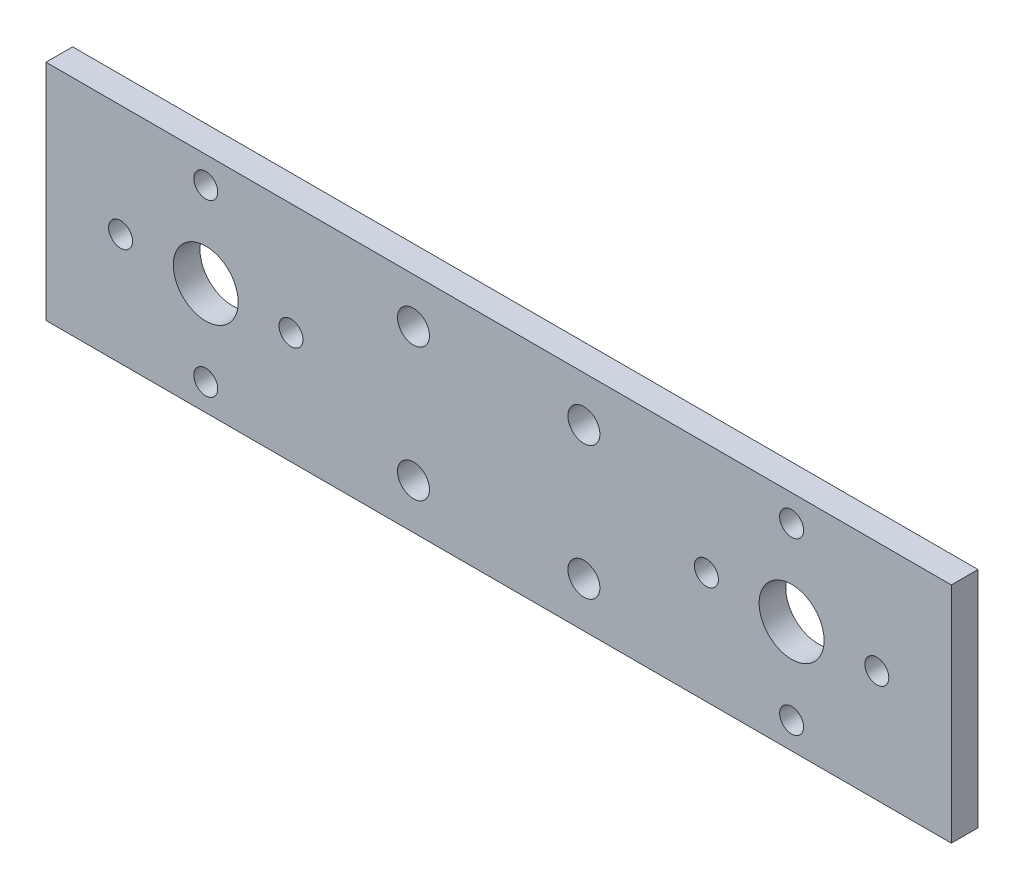
ISO-10303-21;
HEADER;
FILE_DESCRIPTION(('STEP AP214'),'2;1');
FILE_NAME('part.step','',(''),(''),'','','');
FILE_SCHEMA(('AUTOMOTIVE_DESIGN { 1 0 10303 214 1 1 1 1 }'));
ENDSEC;
DATA;
#1=APPLICATION_CONTEXT('core data for automotive mechanical design processes');
#2=APPLICATION_PROTOCOL_DEFINITION('international standard','automotive_design',2000,#1);
#3=PRODUCT_CONTEXT('',#1,'mechanical');
#4=PRODUCT('Part','Part','',(#3));
#5=PRODUCT_RELATED_PRODUCT_CATEGORY('part','',(#4));
#6=PRODUCT_DEFINITION_FORMATION('','',#4);
#7=PRODUCT_DEFINITION_CONTEXT('part definition',#1,'design');
#8=PRODUCT_DEFINITION('design','',#6,#7);
#9=PRODUCT_DEFINITION_SHAPE('','',#8);
#10=(LENGTH_UNIT() NAMED_UNIT(*) SI_UNIT(.MILLI.,.METRE.));
#11=(NAMED_UNIT(*) PLANE_ANGLE_UNIT() SI_UNIT($,.RADIAN.));
#12=(NAMED_UNIT(*) SI_UNIT($,.STERADIAN.) SOLID_ANGLE_UNIT());
#13=UNCERTAINTY_MEASURE_WITH_UNIT(LENGTH_MEASURE(1.E-05),#10,'distance_accuracy_value','');
#14=(GEOMETRIC_REPRESENTATION_CONTEXT(3) GLOBAL_UNCERTAINTY_ASSIGNED_CONTEXT((#13)) GLOBAL_UNIT_ASSIGNED_CONTEXT((#10,
#11,#12)) REPRESENTATION_CONTEXT('',''));
#15=CARTESIAN_POINT('',(0.,0.,0.));
#16=DIRECTION('',(0.,0.,1.));
#17=DIRECTION('',(1.,0.,0.));
#18=AXIS2_PLACEMENT_3D('',#15,#16,#17);
#19=CARTESIAN_POINT('',(85.,21.,5.));
#20=DIRECTION('',(-1.,0.,0.));
#21=DIRECTION('',(0.,0.,1.));
#22=AXIS2_PLACEMENT_3D('',#19,#20,#21);
#23=PLANE('',#22);
#24=DIRECTION('',(0.,1.,0.));
#25=VECTOR('',#24,1.);
#26=CARTESIAN_POINT('',(85.,21.,0.));
#27=LINE('',#26,#25);
#28=CARTESIAN_POINT('',(85.,-21.,0.));
#29=VERTEX_POINT('',#28);
#30=CARTESIAN_POINT('',(85.,21.,0.));
#31=VERTEX_POINT('',#30);
#32=EDGE_CURVE('E111',#29,#31,#27,.T.);
#33=ORIENTED_EDGE('',*,*,#32,.T.);
#34=DIRECTION('',(0.,0.,-1.));
#35=VECTOR('',#34,1.);
#36=CARTESIAN_POINT('',(85.,21.,5.));
#37=LINE('',#36,#35);
#38=CARTESIAN_POINT('',(85.,21.,5.));
#39=VERTEX_POINT('',#38);
#40=EDGE_CURVE('E11',#39,#31,#37,.T.);
#41=ORIENTED_EDGE('',*,*,#40,.F.);
#42=DIRECTION('',(0.,1.,0.));
#43=VECTOR('',#42,1.);
#44=CARTESIAN_POINT('',(85.,21.,5.));
#45=LINE('',#44,#43);
#46=CARTESIAN_POINT('',(85.,-21.,5.));
#47=VERTEX_POINT('',#46);
#48=EDGE_CURVE('E95',#47,#39,#45,.T.);
#49=ORIENTED_EDGE('',*,*,#48,.F.);
#50=DIRECTION('',(0.,0.,-1.));
#51=VECTOR('',#50,1.);
#52=CARTESIAN_POINT('',(85.,-21.,5.));
#53=LINE('',#52,#51);
#54=EDGE_CURVE('E107',#47,#29,#53,.T.);
#55=ORIENTED_EDGE('',*,*,#54,.T.);
#56=EDGE_LOOP('',(#33,#41,#49,#55));
#57=FACE_BOUND('',#56,.T.);
#58=ADVANCED_FACE('F43',(#57),#23,.F.);
#59=CARTESIAN_POINT('',(-85.,21.,5.));
#60=DIRECTION('',(0.,-1.,0.));
#61=DIRECTION('',(0.,0.,-1.));
#62=AXIS2_PLACEMENT_3D('',#59,#60,#61);
#63=PLANE('',#62);
#64=DIRECTION('',(-1.,0.,0.));
#65=VECTOR('',#64,1.);
#66=CARTESIAN_POINT('',(-85.,21.,0.));
#67=LINE('',#66,#65);
#68=CARTESIAN_POINT('',(-85.,21.,0.));
#69=VERTEX_POINT('',#68);
#70=EDGE_CURVE('E100',#31,#69,#67,.T.);
#71=ORIENTED_EDGE('',*,*,#70,.T.);
#72=DIRECTION('',(0.,0.,-1.));
#73=VECTOR('',#72,1.);
#74=CARTESIAN_POINT('',(-85.,21.,5.));
#75=LINE('',#74,#73);
#76=CARTESIAN_POINT('',(-85.,21.,5.));
#77=VERTEX_POINT('',#76);
#78=EDGE_CURVE('E52',#77,#69,#75,.T.);
#79=ORIENTED_EDGE('',*,*,#78,.F.);
#80=DIRECTION('',(-1.,0.,0.));
#81=VECTOR('',#80,1.);
#82=CARTESIAN_POINT('',(-85.,21.,5.));
#83=LINE('',#82,#81);
#84=EDGE_CURVE('E90',#39,#77,#83,.T.);
#85=ORIENTED_EDGE('',*,*,#84,.F.);
#86=ORIENTED_EDGE('',*,*,#40,.T.);
#87=EDGE_LOOP('',(#71,#79,#85,#86));
#88=FACE_BOUND('',#87,.T.);
#89=ADVANCED_FACE('F99',(#88),#63,.F.);
#90=CARTESIAN_POINT('',(-85.,21.,5.));
#91=DIRECTION('',(1.,0.,0.));
#92=DIRECTION('',(0.,0.,-1.));
#93=AXIS2_PLACEMENT_3D('',#90,#91,#92);
#94=PLANE('',#93);
#95=DIRECTION('',(0.,-1.,0.));
#96=VECTOR('',#95,1.);
#97=CARTESIAN_POINT('',(-85.,21.,0.));
#98=LINE('',#97,#96);
#99=CARTESIAN_POINT('',(-85.,-21.,0.));
#100=VERTEX_POINT('',#99);
#101=EDGE_CURVE('E77',#69,#100,#98,.T.);
#102=ORIENTED_EDGE('',*,*,#101,.T.);
#103=DIRECTION('',(0.,0.,-1.));
#104=VECTOR('',#103,1.);
#105=CARTESIAN_POINT('',(-85.,-21.,5.));
#106=LINE('',#105,#104);
#107=CARTESIAN_POINT('',(-85.,-21.,5.));
#108=VERTEX_POINT('',#107);
#109=EDGE_CURVE('E102',#108,#100,#106,.T.);
#110=ORIENTED_EDGE('',*,*,#109,.F.);
#111=DIRECTION('',(0.,-1.,0.));
#112=VECTOR('',#111,1.);
#113=CARTESIAN_POINT('',(-85.,21.,5.));
#114=LINE('',#113,#112);
#115=EDGE_CURVE('E93',#77,#108,#114,.T.);
#116=ORIENTED_EDGE('',*,*,#115,.F.);
#117=ORIENTED_EDGE('',*,*,#78,.T.);
#118=EDGE_LOOP('',(#102,#110,#116,#117));
#119=FACE_BOUND('',#118,.T.);
#120=ADVANCED_FACE('F103',(#119),#94,.F.);
#121=CARTESIAN_POINT('',(-85.,-21.,5.));
#122=DIRECTION('',(0.,1.,0.));
#123=DIRECTION('',(0.,0.,1.));
#124=AXIS2_PLACEMENT_3D('',#121,#122,#123);
#125=PLANE('',#124);
#126=DIRECTION('',(1.,0.,0.));
#127=VECTOR('',#126,1.);
#128=CARTESIAN_POINT('',(-85.,-21.,0.));
#129=LINE('',#128,#127);
#130=EDGE_CURVE('E83',#100,#29,#129,.T.);
#131=ORIENTED_EDGE('',*,*,#130,.T.);
#132=ORIENTED_EDGE('',*,*,#54,.F.);
#133=DIRECTION('',(1.,0.,0.));
#134=VECTOR('',#133,1.);
#135=CARTESIAN_POINT('',(-85.,-21.,5.));
#136=LINE('',#135,#134);
#137=EDGE_CURVE('E60',#108,#47,#136,.T.);
#138=ORIENTED_EDGE('',*,*,#137,.F.);
#139=ORIENTED_EDGE('',*,*,#109,.T.);
#140=EDGE_LOOP('',(#131,#132,#138,#139));
#141=FACE_BOUND('',#140,.T.);
#142=ADVANCED_FACE('F125',(#141),#125,.F.);
#143=CARTESIAN_POINT('',(0.,0.,5.));
#144=DIRECTION('',(0.,0.,1.));
#145=DIRECTION('',(1.,0.,0.));
#146=AXIS2_PLACEMENT_3D('',#143,#144,#145);
#147=PLANE('',#146);
#148=CARTESIAN_POINT('',(-71.,0.,5.));
#149=DIRECTION('',(0.,0.,1.));
#150=DIRECTION('',(1.,0.,0.));
#151=AXIS2_PLACEMENT_3D('',#148,#149,#150);
#152=CIRCLE('',#151,2.25);
#153=CARTESIAN_POINT('',(-68.75,0.,5.));
#154=VERTEX_POINT('',#153);
#155=EDGE_CURVE('E222',#154,#154,#152,.T.);
#156=ORIENTED_EDGE('',*,*,#155,.F.);
#157=EDGE_LOOP('',(#156));
#158=FACE_BOUND('',#157,.T.);
#159=CARTESIAN_POINT('',(39.,-3.88578058618805E-13,5.));
#160=DIRECTION('',(0.,0.,1.));
#161=DIRECTION('',(1.,0.,0.));
#162=AXIS2_PLACEMENT_3D('',#159,#160,#161);
#163=CIRCLE('',#162,2.25);
#164=CARTESIAN_POINT('',(41.25,-3.88578058618805E-13,5.));
#165=VERTEX_POINT('',#164);
#166=EDGE_CURVE('E226',#165,#165,#163,.T.);
#167=ORIENTED_EDGE('',*,*,#166,.F.);
#168=EDGE_LOOP('',(#167));
#169=FACE_BOUND('',#168,.T.);
#170=CARTESIAN_POINT('',(-55.0000000000002,-16.,5.));
#171=DIRECTION('',(0.,0.,1.));
#172=DIRECTION('',(1.,0.,0.));
#173=AXIS2_PLACEMENT_3D('',#170,#171,#172);
#174=CIRCLE('',#173,2.24999999999999);
#175=CARTESIAN_POINT('',(-52.7500000000002,-16.,5.));
#176=VERTEX_POINT('',#175);
#177=EDGE_CURVE('E210',#176,#176,#174,.T.);
#178=ORIENTED_EDGE('',*,*,#177,.F.);
#179=EDGE_LOOP('',(#178));
#180=FACE_BOUND('',#179,.T.);
#181=CARTESIAN_POINT('',(-39.,-1.15427216060123E-13,5.));
#182=DIRECTION('',(0.,0.,1.));
#183=DIRECTION('',(1.,0.,0.));
#184=AXIS2_PLACEMENT_3D('',#181,#182,#183);
#185=CIRCLE('',#184,2.24999999999999);
#186=CARTESIAN_POINT('',(-36.75,-1.15427216060123E-13,5.));
#187=VERTEX_POINT('',#186);
#188=EDGE_CURVE('E209',#187,#187,#185,.T.);
#189=ORIENTED_EDGE('',*,*,#188,.F.);
#190=EDGE_LOOP('',(#189));
#191=FACE_BOUND('',#190,.T.);
#192=CARTESIAN_POINT('',(-54.9999999999999,16.,5.));
#193=DIRECTION('',(0.,0.,1.));
#194=DIRECTION('',(1.,0.,0.));
#195=AXIS2_PLACEMENT_3D('',#192,#193,#194);
#196=CIRCLE('',#195,2.24999999999999);
#197=CARTESIAN_POINT('',(-52.75,16.,5.));
#198=VERTEX_POINT('',#197);
#199=EDGE_CURVE('E218',#198,#198,#196,.T.);
#200=ORIENTED_EDGE('',*,*,#199,.F.);
#201=EDGE_LOOP('',(#200));
#202=FACE_BOUND('',#201,.T.);
#203=CARTESIAN_POINT('',(55.0000000000001,15.9999999999996,5.));
#204=DIRECTION('',(0.,0.,1.));
#205=DIRECTION('',(1.,0.,0.));
#206=AXIS2_PLACEMENT_3D('',#203,#204,#205);
#207=CIRCLE('',#206,2.25);
#208=CARTESIAN_POINT('',(57.2500000000001,15.9999999999996,5.));
#209=VERTEX_POINT('',#208);
#210=EDGE_CURVE('E200',#209,#209,#207,.T.);
#211=ORIENTED_EDGE('',*,*,#210,.F.);
#212=EDGE_LOOP('',(#211));
#213=FACE_BOUND('',#212,.T.);
#214=CARTESIAN_POINT('',(71.,-4.9960036108132E-13,5.));
#215=DIRECTION('',(0.,0.,1.));
#216=DIRECTION('',(1.,0.,0.));
#217=AXIS2_PLACEMENT_3D('',#214,#215,#216);
#218=CIRCLE('',#217,2.24999999999999);
#219=CARTESIAN_POINT('',(73.25,-4.9960036108132E-13,5.));
#220=VERTEX_POINT('',#219);
#221=EDGE_CURVE('E192',#220,#220,#218,.T.);
#222=ORIENTED_EDGE('',*,*,#221,.F.);
#223=EDGE_LOOP('',(#222));
#224=FACE_BOUND('',#223,.T.);
#225=CARTESIAN_POINT('',(54.9999999999998,-16.0000000000004,5.));
#226=DIRECTION('',(0.,0.,1.));
#227=DIRECTION('',(1.,0.,0.));
#228=AXIS2_PLACEMENT_3D('',#225,#226,#227);
#229=CIRCLE('',#228,2.24999999999999);
#230=CARTESIAN_POINT('',(57.2499999999998,-16.0000000000004,5.));
#231=VERTEX_POINT('',#230);
#232=EDGE_CURVE('E184',#231,#231,#229,.T.);
#233=ORIENTED_EDGE('',*,*,#232,.F.);
#234=EDGE_LOOP('',(#233));
#235=FACE_BOUND('',#234,.T.);
#236=CARTESIAN_POINT('',(16.0000000000001,-12.4999999999996,5.));
#237=DIRECTION('',(0.,0.,1.));
#238=DIRECTION('',(1.,0.,0.));
#239=AXIS2_PLACEMENT_3D('',#236,#237,#238);
#240=CIRCLE('',#239,2.99999999999999);
#241=CARTESIAN_POINT('',(19.0000000000001,-12.4999999999996,5.));
#242=VERTEX_POINT('',#241);
#243=EDGE_CURVE('E160',#242,#242,#240,.T.);
#244=ORIENTED_EDGE('',*,*,#243,.F.);
#245=EDGE_LOOP('',(#244));
#246=FACE_BOUND('',#245,.T.);
#247=CARTESIAN_POINT('',(16.,12.5000000000004,5.));
#248=DIRECTION('',(0.,0.,1.));
#249=DIRECTION('',(1.,0.,0.));
#250=AXIS2_PLACEMENT_3D('',#247,#248,#249);
#251=CIRCLE('',#250,3.);
#252=CARTESIAN_POINT('',(19.,12.5000000000004,5.));
#253=VERTEX_POINT('',#252);
#254=EDGE_CURVE('E169',#253,#253,#251,.T.);
#255=ORIENTED_EDGE('',*,*,#254,.F.);
#256=EDGE_LOOP('',(#255));
#257=FACE_BOUND('',#256,.T.);
#258=CARTESIAN_POINT('',(-16.,12.4999999999999,5.));
#259=DIRECTION('',(0.,0.,1.));
#260=DIRECTION('',(1.,0.,0.));
#261=AXIS2_PLACEMENT_3D('',#258,#259,#260);
#262=CIRCLE('',#261,3.);
#263=CARTESIAN_POINT('',(-13.,12.4999999999999,5.));
#264=VERTEX_POINT('',#263);
#265=EDGE_CURVE('E152',#264,#264,#262,.T.);
#266=ORIENTED_EDGE('',*,*,#265,.F.);
#267=EDGE_LOOP('',(#266));
#268=FACE_BOUND('',#267,.T.);
#269=CARTESIAN_POINT('',(-16.,-12.5000000000001,5.));
#270=DIRECTION('',(0.,0.,1.));
#271=DIRECTION('',(1.,0.,0.));
#272=AXIS2_PLACEMENT_3D('',#269,#270,#271);
#273=CIRCLE('',#272,3.);
#274=CARTESIAN_POINT('',(-13.,-12.5000000000001,5.));
#275=VERTEX_POINT('',#274);
#276=EDGE_CURVE('E148',#275,#275,#273,.T.);
#277=ORIENTED_EDGE('',*,*,#276,.F.);
#278=EDGE_LOOP('',(#277));
#279=FACE_BOUND('',#278,.T.);
#280=CARTESIAN_POINT('',(-55.,0.,5.));
#281=DIRECTION('',(0.,0.,1.));
#282=DIRECTION('',(1.,0.,0.));
#283=AXIS2_PLACEMENT_3D('',#280,#281,#282);
#284=CIRCLE('',#283,6.1);
#285=CARTESIAN_POINT('',(-48.9,0.,5.));
#286=VERTEX_POINT('',#285);
#287=EDGE_CURVE('E115',#286,#286,#284,.T.);
#288=ORIENTED_EDGE('',*,*,#287,.F.);
#289=EDGE_LOOP('',(#288));
#290=FACE_BOUND('',#289,.T.);
#291=CARTESIAN_POINT('',(55.,-3.90798504668055E-13,5.));
#292=DIRECTION('',(0.,0.,1.));
#293=DIRECTION('',(1.,0.,0.));
#294=AXIS2_PLACEMENT_3D('',#291,#292,#293);
#295=CIRCLE('',#294,6.1);
#296=CARTESIAN_POINT('',(61.1,-3.90798504668055E-13,5.));
#297=VERTEX_POINT('',#296);
#298=EDGE_CURVE('E135',#297,#297,#295,.T.);
#299=ORIENTED_EDGE('',*,*,#298,.F.);
#300=EDGE_LOOP('',(#299));
#301=FACE_BOUND('',#300,.T.);
#302=ORIENTED_EDGE('',*,*,#48,.T.);
#303=ORIENTED_EDGE('',*,*,#84,.T.);
#304=ORIENTED_EDGE('',*,*,#115,.T.);
#305=ORIENTED_EDGE('',*,*,#137,.T.);
#306=EDGE_LOOP('',(#302,#303,#304,#305));
#307=FACE_BOUND('',#306,.T.);
#308=ADVANCED_FACE('F91',(#158,#169,#180,#191,#202,#213,#224,#235,#246,#257,#268,#279,#290,#301,
#307),#147,.T.);
#309=CARTESIAN_POINT('',(0.,0.,0.));
#310=DIRECTION('',(0.,0.,1.));
#311=DIRECTION('',(1.,0.,0.));
#312=AXIS2_PLACEMENT_3D('',#309,#310,#311);
#313=PLANE('',#312);
#314=CARTESIAN_POINT('',(-71.,0.,0.));
#315=DIRECTION('',(0.,0.,1.));
#316=DIRECTION('',(1.,0.,0.));
#317=AXIS2_PLACEMENT_3D('',#314,#315,#316);
#318=CIRCLE('',#317,2.25);
#319=CARTESIAN_POINT('',(-68.75,0.,0.));
#320=VERTEX_POINT('',#319);
#321=EDGE_CURVE('E161',#320,#320,#318,.T.);
#322=ORIENTED_EDGE('',*,*,#321,.T.);
#323=EDGE_LOOP('',(#322));
#324=FACE_BOUND('',#323,.T.);
#325=CARTESIAN_POINT('',(39.,-3.88578058618805E-13,0.));
#326=DIRECTION('',(0.,0.,1.));
#327=DIRECTION('',(1.,0.,0.));
#328=AXIS2_PLACEMENT_3D('',#325,#326,#327);
#329=CIRCLE('',#328,2.25);
#330=CARTESIAN_POINT('',(41.25,-3.88578058618805E-13,0.));
#331=VERTEX_POINT('',#330);
#332=EDGE_CURVE('E204',#331,#331,#329,.T.);
#333=ORIENTED_EDGE('',*,*,#332,.T.);
#334=EDGE_LOOP('',(#333));
#335=FACE_BOUND('',#334,.T.);
#336=CARTESIAN_POINT('',(-55.0000000000002,-16.,0.));
#337=DIRECTION('',(0.,0.,1.));
#338=DIRECTION('',(1.,0.,0.));
#339=AXIS2_PLACEMENT_3D('',#336,#337,#338);
#340=CIRCLE('',#339,2.24999999999999);
#341=CARTESIAN_POINT('',(-52.7500000000002,-16.,0.));
#342=VERTEX_POINT('',#341);
#343=EDGE_CURVE('E230',#342,#342,#340,.T.);
#344=ORIENTED_EDGE('',*,*,#343,.T.);
#345=EDGE_LOOP('',(#344));
#346=FACE_BOUND('',#345,.T.);
#347=CARTESIAN_POINT('',(-39.,-1.15427216060123E-13,0.));
#348=DIRECTION('',(0.,0.,1.));
#349=DIRECTION('',(1.,0.,0.));
#350=AXIS2_PLACEMENT_3D('',#347,#348,#349);
#351=CIRCLE('',#350,2.24999999999999);
#352=CARTESIAN_POINT('',(-36.75,-1.15427216060123E-13,0.));
#353=VERTEX_POINT('',#352);
#354=EDGE_CURVE('E205',#353,#353,#351,.T.);
#355=ORIENTED_EDGE('',*,*,#354,.T.);
#356=EDGE_LOOP('',(#355));
#357=FACE_BOUND('',#356,.T.);
#358=CARTESIAN_POINT('',(-54.9999999999999,16.,0.));
#359=DIRECTION('',(0.,0.,1.));
#360=DIRECTION('',(1.,0.,0.));
#361=AXIS2_PLACEMENT_3D('',#358,#359,#360);
#362=CIRCLE('',#361,2.24999999999999);
#363=CARTESIAN_POINT('',(-52.75,16.,0.));
#364=VERTEX_POINT('',#363);
#365=EDGE_CURVE('E214',#364,#364,#362,.T.);
#366=ORIENTED_EDGE('',*,*,#365,.T.);
#367=EDGE_LOOP('',(#366));
#368=FACE_BOUND('',#367,.T.);
#369=CARTESIAN_POINT('',(55.0000000000001,15.9999999999996,0.));
#370=DIRECTION('',(0.,0.,1.));
#371=DIRECTION('',(1.,0.,0.));
#372=AXIS2_PLACEMENT_3D('',#369,#370,#371);
#373=CIRCLE('',#372,2.25);
#374=CARTESIAN_POINT('',(57.2500000000001,15.9999999999996,0.));
#375=VERTEX_POINT('',#374);
#376=EDGE_CURVE('E196',#375,#375,#373,.T.);
#377=ORIENTED_EDGE('',*,*,#376,.T.);
#378=EDGE_LOOP('',(#377));
#379=FACE_BOUND('',#378,.T.);
#380=CARTESIAN_POINT('',(71.,-4.9960036108132E-13,0.));
#381=DIRECTION('',(0.,0.,1.));
#382=DIRECTION('',(1.,0.,0.));
#383=AXIS2_PLACEMENT_3D('',#380,#381,#382);
#384=CIRCLE('',#383,2.24999999999999);
#385=CARTESIAN_POINT('',(73.25,-4.9960036108132E-13,0.));
#386=VERTEX_POINT('',#385);
#387=EDGE_CURVE('E188',#386,#386,#384,.T.);
#388=ORIENTED_EDGE('',*,*,#387,.T.);
#389=EDGE_LOOP('',(#388));
#390=FACE_BOUND('',#389,.T.);
#391=CARTESIAN_POINT('',(54.9999999999998,-16.0000000000004,0.));
#392=DIRECTION('',(0.,0.,1.));
#393=DIRECTION('',(1.,0.,0.));
#394=AXIS2_PLACEMENT_3D('',#391,#392,#393);
#395=CIRCLE('',#394,2.24999999999999);
#396=CARTESIAN_POINT('',(57.2499999999998,-16.0000000000004,0.));
#397=VERTEX_POINT('',#396);
#398=EDGE_CURVE('E180',#397,#397,#395,.T.);
#399=ORIENTED_EDGE('',*,*,#398,.T.);
#400=EDGE_LOOP('',(#399));
#401=FACE_BOUND('',#400,.T.);
#402=CARTESIAN_POINT('',(16.0000000000001,-12.4999999999996,0.));
#403=DIRECTION('',(0.,0.,1.));
#404=DIRECTION('',(1.,0.,0.));
#405=AXIS2_PLACEMENT_3D('',#402,#403,#404);
#406=CIRCLE('',#405,2.99999999999999);
#407=CARTESIAN_POINT('',(19.0000000000001,-12.4999999999996,0.));
#408=VERTEX_POINT('',#407);
#409=EDGE_CURVE('E156',#408,#408,#406,.T.);
#410=ORIENTED_EDGE('',*,*,#409,.T.);
#411=EDGE_LOOP('',(#410));
#412=FACE_BOUND('',#411,.T.);
#413=CARTESIAN_POINT('',(16.,12.5000000000004,0.));
#414=DIRECTION('',(0.,0.,1.));
#415=DIRECTION('',(1.,0.,0.));
#416=AXIS2_PLACEMENT_3D('',#413,#414,#415);
#417=CIRCLE('',#416,3.);
#418=CARTESIAN_POINT('',(19.,12.5000000000004,0.));
#419=VERTEX_POINT('',#418);
#420=EDGE_CURVE('E165',#419,#419,#417,.T.);
#421=ORIENTED_EDGE('',*,*,#420,.T.);
#422=EDGE_LOOP('',(#421));
#423=FACE_BOUND('',#422,.T.);
#424=CARTESIAN_POINT('',(-16.,12.4999999999999,0.));
#425=DIRECTION('',(0.,0.,1.));
#426=DIRECTION('',(1.,0.,0.));
#427=AXIS2_PLACEMENT_3D('',#424,#425,#426);
#428=CIRCLE('',#427,3.);
#429=CARTESIAN_POINT('',(-13.,12.4999999999999,0.));
#430=VERTEX_POINT('',#429);
#431=EDGE_CURVE('E173',#430,#430,#428,.T.);
#432=ORIENTED_EDGE('',*,*,#431,.T.);
#433=EDGE_LOOP('',(#432));
#434=FACE_BOUND('',#433,.T.);
#435=CARTESIAN_POINT('',(-16.,-12.5000000000001,0.));
#436=DIRECTION('',(0.,0.,1.));
#437=DIRECTION('',(1.,0.,0.));
#438=AXIS2_PLACEMENT_3D('',#435,#436,#437);
#439=CIRCLE('',#438,3.);
#440=CARTESIAN_POINT('',(-13.,-12.5000000000001,0.));
#441=VERTEX_POINT('',#440);
#442=EDGE_CURVE('E144',#441,#441,#439,.T.);
#443=ORIENTED_EDGE('',*,*,#442,.T.);
#444=EDGE_LOOP('',(#443));
#445=FACE_BOUND('',#444,.T.);
#446=CARTESIAN_POINT('',(-55.,0.,0.));
#447=DIRECTION('',(0.,0.,1.));
#448=DIRECTION('',(1.,0.,0.));
#449=AXIS2_PLACEMENT_3D('',#446,#447,#448);
#450=CIRCLE('',#449,6.1);
#451=CARTESIAN_POINT('',(-48.9,0.,0.));
#452=VERTEX_POINT('',#451);
#453=EDGE_CURVE('E139',#452,#452,#450,.T.);
#454=ORIENTED_EDGE('',*,*,#453,.T.);
#455=EDGE_LOOP('',(#454));
#456=FACE_BOUND('',#455,.T.);
#457=CARTESIAN_POINT('',(55.,-3.90798504668055E-13,0.));
#458=DIRECTION('',(0.,0.,1.));
#459=DIRECTION('',(1.,0.,0.));
#460=AXIS2_PLACEMENT_3D('',#457,#458,#459);
#461=CIRCLE('',#460,6.1);
#462=CARTESIAN_POINT('',(61.1,-3.90798504668055E-13,0.));
#463=VERTEX_POINT('',#462);
#464=EDGE_CURVE('E140',#463,#463,#461,.T.);
#465=ORIENTED_EDGE('',*,*,#464,.T.);
#466=EDGE_LOOP('',(#465));
#467=FACE_BOUND('',#466,.T.);
#468=ORIENTED_EDGE('',*,*,#32,.F.);
#469=ORIENTED_EDGE('',*,*,#130,.F.);
#470=ORIENTED_EDGE('',*,*,#101,.F.);
#471=ORIENTED_EDGE('',*,*,#70,.F.);
#472=EDGE_LOOP('',(#468,#469,#470,#471));
#473=FACE_BOUND('',#472,.T.);
#474=ADVANCED_FACE('F128',(#324,#335,#346,#357,#368,#379,#390,#401,#412,#423,#434,#445,#456,
#467,#473),#313,.F.);
#475=CARTESIAN_POINT('',(55.,-3.90798504668055E-13,0.));
#476=DIRECTION('',(0.,0.,1.));
#477=DIRECTION('',(1.,0.,0.));
#478=AXIS2_PLACEMENT_3D('',#475,#476,#477);
#479=CYLINDRICAL_SURFACE('',#478,6.1);
#480=ORIENTED_EDGE('',*,*,#298,.T.);
#481=EDGE_LOOP('',(#480));
#482=FACE_BOUND('',#481,.T.);
#483=ORIENTED_EDGE('',*,*,#464,.F.);
#484=EDGE_LOOP('',(#483));
#485=FACE_BOUND('',#484,.T.);
#486=ADVANCED_FACE('F282',(#482,#485),#479,.F.);
#487=CARTESIAN_POINT('',(-55.,0.,0.));
#488=DIRECTION('',(0.,0.,1.));
#489=DIRECTION('',(1.,0.,0.));
#490=AXIS2_PLACEMENT_3D('',#487,#488,#489);
#491=CYLINDRICAL_SURFACE('',#490,6.1);
#492=ORIENTED_EDGE('',*,*,#287,.T.);
#493=EDGE_LOOP('',(#492));
#494=FACE_BOUND('',#493,.T.);
#495=ORIENTED_EDGE('',*,*,#453,.F.);
#496=EDGE_LOOP('',(#495));
#497=FACE_BOUND('',#496,.T.);
#498=ADVANCED_FACE('F285',(#494,#497),#491,.F.);
#499=CARTESIAN_POINT('',(-16.,-12.5000000000001,0.));
#500=DIRECTION('',(0.,0.,1.));
#501=DIRECTION('',(1.,0.,0.));
#502=AXIS2_PLACEMENT_3D('',#499,#500,#501);
#503=CYLINDRICAL_SURFACE('',#502,3.);
#504=ORIENTED_EDGE('',*,*,#442,.F.);
#505=EDGE_LOOP('',(#504));
#506=FACE_BOUND('',#505,.T.);
#507=ORIENTED_EDGE('',*,*,#276,.T.);
#508=EDGE_LOOP('',(#507));
#509=FACE_BOUND('',#508,.T.);
#510=ADVANCED_FACE('F441',(#506,#509),#503,.F.);
#511=CARTESIAN_POINT('',(-16.,12.4999999999999,0.));
#512=DIRECTION('',(0.,0.,1.));
#513=DIRECTION('',(1.,0.,0.));
#514=AXIS2_PLACEMENT_3D('',#511,#512,#513);
#515=CYLINDRICAL_SURFACE('',#514,3.);
#516=ORIENTED_EDGE('',*,*,#431,.F.);
#517=EDGE_LOOP('',(#516));
#518=FACE_BOUND('',#517,.T.);
#519=ORIENTED_EDGE('',*,*,#265,.T.);
#520=EDGE_LOOP('',(#519));
#521=FACE_BOUND('',#520,.T.);
#522=ADVANCED_FACE('F432',(#518,#521),#515,.F.);
#523=CARTESIAN_POINT('',(16.,12.5000000000004,0.));
#524=DIRECTION('',(0.,0.,1.));
#525=DIRECTION('',(1.,0.,0.));
#526=AXIS2_PLACEMENT_3D('',#523,#524,#525);
#527=CYLINDRICAL_SURFACE('',#526,3.);
#528=ORIENTED_EDGE('',*,*,#420,.F.);
#529=EDGE_LOOP('',(#528));
#530=FACE_BOUND('',#529,.T.);
#531=ORIENTED_EDGE('',*,*,#254,.T.);
#532=EDGE_LOOP('',(#531));
#533=FACE_BOUND('',#532,.T.);
#534=ADVANCED_FACE('F423',(#530,#533),#527,.F.);
#535=CARTESIAN_POINT('',(16.0000000000001,-12.4999999999996,0.));
#536=DIRECTION('',(0.,0.,1.));
#537=DIRECTION('',(1.,0.,0.));
#538=AXIS2_PLACEMENT_3D('',#535,#536,#537);
#539=CYLINDRICAL_SURFACE('',#538,2.99999999999999);
#540=ORIENTED_EDGE('',*,*,#409,.F.);
#541=EDGE_LOOP('',(#540));
#542=FACE_BOUND('',#541,.T.);
#543=ORIENTED_EDGE('',*,*,#243,.T.);
#544=EDGE_LOOP('',(#543));
#545=FACE_BOUND('',#544,.T.);
#546=ADVANCED_FACE('F319',(#542,#545),#539,.F.);
#547=CARTESIAN_POINT('',(54.9999999999998,-16.0000000000004,0.));
#548=DIRECTION('',(0.,0.,1.));
#549=DIRECTION('',(1.,0.,0.));
#550=AXIS2_PLACEMENT_3D('',#547,#548,#549);
#551=CYLINDRICAL_SURFACE('',#550,2.24999999999999);
#552=ORIENTED_EDGE('',*,*,#398,.F.);
#553=EDGE_LOOP('',(#552));
#554=FACE_BOUND('',#553,.T.);
#555=ORIENTED_EDGE('',*,*,#232,.T.);
#556=EDGE_LOOP('',(#555));
#557=FACE_BOUND('',#556,.T.);
#558=ADVANCED_FACE('F330',(#554,#557),#551,.F.);
#559=CARTESIAN_POINT('',(71.,-4.9960036108132E-13,0.));
#560=DIRECTION('',(0.,0.,1.));
#561=DIRECTION('',(1.,0.,0.));
#562=AXIS2_PLACEMENT_3D('',#559,#560,#561);
#563=CYLINDRICAL_SURFACE('',#562,2.24999999999999);
#564=ORIENTED_EDGE('',*,*,#387,.F.);
#565=EDGE_LOOP('',(#564));
#566=FACE_BOUND('',#565,.T.);
#567=ORIENTED_EDGE('',*,*,#221,.T.);
#568=EDGE_LOOP('',(#567));
#569=FACE_BOUND('',#568,.T.);
#570=ADVANCED_FACE('F335',(#566,#569),#563,.F.);
#571=CARTESIAN_POINT('',(55.0000000000001,15.9999999999996,0.));
#572=DIRECTION('',(0.,0.,1.));
#573=DIRECTION('',(1.,0.,0.));
#574=AXIS2_PLACEMENT_3D('',#571,#572,#573);
#575=CYLINDRICAL_SURFACE('',#574,2.25);
#576=ORIENTED_EDGE('',*,*,#376,.F.);
#577=EDGE_LOOP('',(#576));
#578=FACE_BOUND('',#577,.T.);
#579=ORIENTED_EDGE('',*,*,#210,.T.);
#580=EDGE_LOOP('',(#579));
#581=FACE_BOUND('',#580,.T.);
#582=ADVANCED_FACE('F346',(#578,#581),#575,.F.);
#583=CARTESIAN_POINT('',(-54.9999999999999,16.,0.));
#584=DIRECTION('',(0.,0.,1.));
#585=DIRECTION('',(1.,0.,0.));
#586=AXIS2_PLACEMENT_3D('',#583,#584,#585);
#587=CYLINDRICAL_SURFACE('',#586,2.24999999999999);
#588=ORIENTED_EDGE('',*,*,#365,.F.);
#589=EDGE_LOOP('',(#588));
#590=FACE_BOUND('',#589,.T.);
#591=ORIENTED_EDGE('',*,*,#199,.T.);
#592=EDGE_LOOP('',(#591));
#593=FACE_BOUND('',#592,.T.);
#594=ADVANCED_FACE('F357',(#590,#593),#587,.F.);
#595=CARTESIAN_POINT('',(-39.,-1.15427216060123E-13,0.));
#596=DIRECTION('',(0.,0.,1.));
#597=DIRECTION('',(1.,0.,0.));
#598=AXIS2_PLACEMENT_3D('',#595,#596,#597);
#599=CYLINDRICAL_SURFACE('',#598,2.24999999999999);
#600=ORIENTED_EDGE('',*,*,#354,.F.);
#601=EDGE_LOOP('',(#600));
#602=FACE_BOUND('',#601,.T.);
#603=ORIENTED_EDGE('',*,*,#188,.T.);
#604=EDGE_LOOP('',(#603));
#605=FACE_BOUND('',#604,.T.);
#606=ADVANCED_FACE('F368',(#602,#605),#599,.F.);
#607=CARTESIAN_POINT('',(-55.0000000000002,-16.,0.));
#608=DIRECTION('',(0.,0.,1.));
#609=DIRECTION('',(1.,0.,0.));
#610=AXIS2_PLACEMENT_3D('',#607,#608,#609);
#611=CYLINDRICAL_SURFACE('',#610,2.24999999999999);
#612=ORIENTED_EDGE('',*,*,#343,.F.);
#613=EDGE_LOOP('',(#612));
#614=FACE_BOUND('',#613,.T.);
#615=ORIENTED_EDGE('',*,*,#177,.T.);
#616=EDGE_LOOP('',(#615));
#617=FACE_BOUND('',#616,.T.);
#618=ADVANCED_FACE('F379',(#614,#617),#611,.F.);
#619=CARTESIAN_POINT('',(39.,-3.88578058618805E-13,0.));
#620=DIRECTION('',(0.,0.,1.));
#621=DIRECTION('',(1.,0.,0.));
#622=AXIS2_PLACEMENT_3D('',#619,#620,#621);
#623=CYLINDRICAL_SURFACE('',#622,2.25);
#624=ORIENTED_EDGE('',*,*,#332,.F.);
#625=EDGE_LOOP('',(#624));
#626=FACE_BOUND('',#625,.T.);
#627=ORIENTED_EDGE('',*,*,#166,.T.);
#628=EDGE_LOOP('',(#627));
#629=FACE_BOUND('',#628,.T.);
#630=ADVANCED_FACE('F249',(#626,#629),#623,.F.);
#631=CARTESIAN_POINT('',(-71.,0.,0.));
#632=DIRECTION('',(0.,0.,1.));
#633=DIRECTION('',(1.,0.,0.));
#634=AXIS2_PLACEMENT_3D('',#631,#632,#633);
#635=CYLINDRICAL_SURFACE('',#634,2.25);
#636=ORIENTED_EDGE('',*,*,#321,.F.);
#637=EDGE_LOOP('',(#636));
#638=FACE_BOUND('',#637,.T.);
#639=ORIENTED_EDGE('',*,*,#155,.T.);
#640=EDGE_LOOP('',(#639));
#641=FACE_BOUND('',#640,.T.);
#642=ADVANCED_FACE('F246',(#638,#641),#635,.F.);
#643=CLOSED_SHELL('',(#58,#89,#120,#142,#308,#474,#486,#498,#510,#522,#534,#546,#558,#570,#582,
#594,#606,#618,#630,#642));
#644=MANIFOLD_SOLID_BREP('B2',#643);
#645=ADVANCED_BREP_SHAPE_REPRESENTATION('',(#18,#644),#14);
#646=SHAPE_DEFINITION_REPRESENTATION(#9,#645);
ENDSEC;
END-ISO-10303-21;
